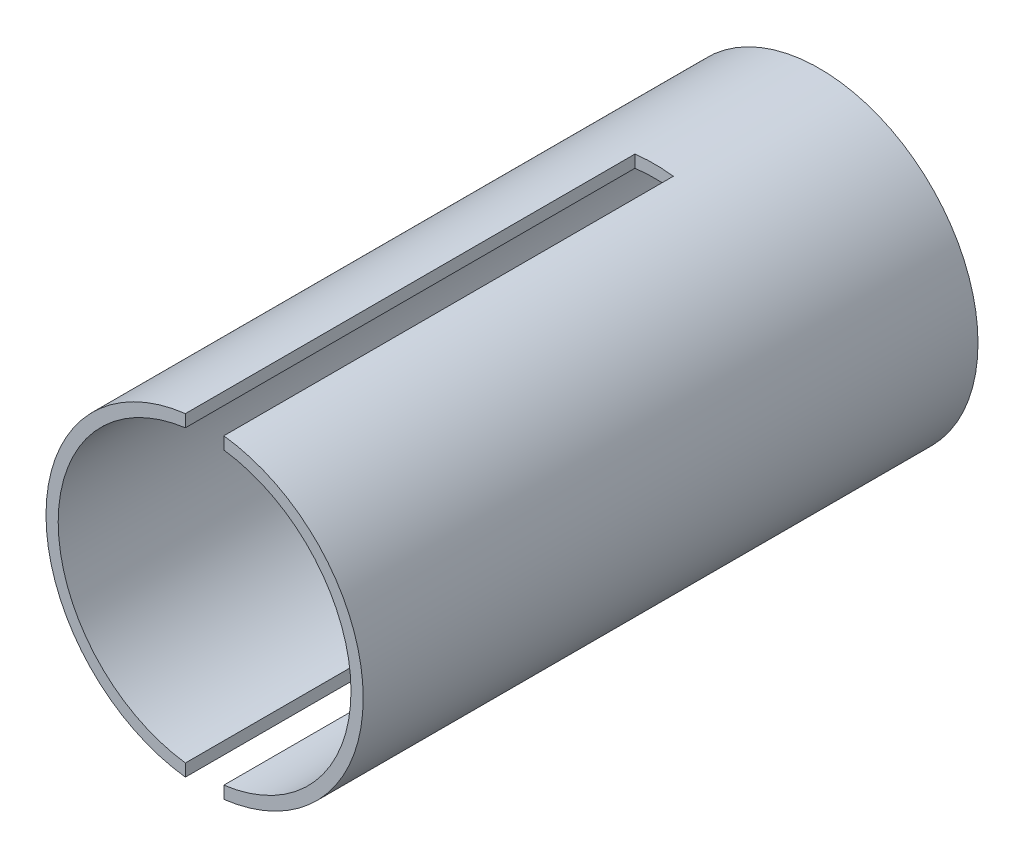
ISO-10303-21;
HEADER;
FILE_DESCRIPTION(('STEP AP214'),'2;1');
FILE_NAME('part.step','',(''),(''),'','','');
FILE_SCHEMA(('AUTOMOTIVE_DESIGN { 1 0 10303 214 1 1 1 1 }'));
ENDSEC;
DATA;
#1=APPLICATION_CONTEXT('core data for automotive mechanical design processes');
#2=APPLICATION_PROTOCOL_DEFINITION('international standard','automotive_design',2000,#1);
#3=PRODUCT_CONTEXT('',#1,'mechanical');
#4=PRODUCT('Part','Part','',(#3));
#5=PRODUCT_RELATED_PRODUCT_CATEGORY('part','',(#4));
#6=PRODUCT_DEFINITION_FORMATION('','',#4);
#7=PRODUCT_DEFINITION_CONTEXT('part definition',#1,'design');
#8=PRODUCT_DEFINITION('design','',#6,#7);
#9=PRODUCT_DEFINITION_SHAPE('','',#8);
#10=(LENGTH_UNIT() NAMED_UNIT(*) SI_UNIT(.MILLI.,.METRE.));
#11=(NAMED_UNIT(*) PLANE_ANGLE_UNIT() SI_UNIT($,.RADIAN.));
#12=(NAMED_UNIT(*) SI_UNIT($,.STERADIAN.) SOLID_ANGLE_UNIT());
#13=UNCERTAINTY_MEASURE_WITH_UNIT(LENGTH_MEASURE(1.E-05),#10,'distance_accuracy_value','');
#14=(GEOMETRIC_REPRESENTATION_CONTEXT(3) GLOBAL_UNCERTAINTY_ASSIGNED_CONTEXT((#13)) GLOBAL_UNIT_ASSIGNED_CONTEXT((#10,
#11,#12)) REPRESENTATION_CONTEXT('',''));
#15=CARTESIAN_POINT('',(0.,0.,0.));
#16=DIRECTION('',(0.,0.,1.));
#17=DIRECTION('',(1.,0.,0.));
#18=AXIS2_PLACEMENT_3D('',#15,#16,#17);
#19=CARTESIAN_POINT('',(0.,0.,160.));
#20=DIRECTION('',(0.,0.,1.));
#21=DIRECTION('',(1.,0.,0.));
#22=AXIS2_PLACEMENT_3D('',#19,#20,#21);
#23=PLANE('',#22);
#24=CARTESIAN_POINT('',(0.,0.,160.));
#25=DIRECTION('',(0.,0.,1.));
#26=DIRECTION('',(1.,0.,0.));
#27=AXIS2_PLACEMENT_3D('',#24,#25,#26);
#28=CIRCLE('',#27,38.1);
#29=CARTESIAN_POINT('',(-5.,37.7704911273338,160.));
#30=VERTEX_POINT('',#29);
#31=CARTESIAN_POINT('',(-5.,-37.7704911273338,160.));
#32=VERTEX_POINT('',#31);
#33=EDGE_CURVE('E169',#30,#32,#28,.T.);
#34=ORIENTED_EDGE('',*,*,#33,.F.);
#35=DIRECTION('',(0.,-1.,0.));
#36=VECTOR('',#35,1.);
#37=CARTESIAN_POINT('',(-5.,50.,160.));
#38=LINE('',#37,#36);
#39=CARTESIAN_POINT('',(-5.,40.9710339752367,160.));
#40=VERTEX_POINT('',#39);
#41=EDGE_CURVE('E203',#40,#30,#38,.T.);
#42=ORIENTED_EDGE('',*,*,#41,.F.);
#43=CARTESIAN_POINT('',(0.,0.,160.));
#44=DIRECTION('',(0.,0.,1.));
#45=DIRECTION('',(1.,0.,0.));
#46=AXIS2_PLACEMENT_3D('',#43,#44,#45);
#47=CIRCLE('',#46,41.275);
#48=CARTESIAN_POINT('',(-5.,-40.9710339752367,160.));
#49=VERTEX_POINT('',#48);
#50=EDGE_CURVE('E177',#40,#49,#47,.T.);
#51=ORIENTED_EDGE('',*,*,#50,.T.);
#52=DIRECTION('',(0.,1.,0.));
#53=VECTOR('',#52,1.);
#54=CARTESIAN_POINT('',(-5.,-50.,160.));
#55=LINE('',#54,#53);
#56=EDGE_CURVE('E137',#49,#32,#55,.T.);
#57=ORIENTED_EDGE('',*,*,#56,.T.);
#58=EDGE_LOOP('',(#34,#42,#51,#57));
#59=FACE_BOUND('',#58,.T.);
#60=ADVANCED_FACE('F45',(#59),#23,.T.);
#61=CARTESIAN_POINT('',(5.,-40.9710339752367,160.));
#62=VERTEX_POINT('',#61);
#63=CARTESIAN_POINT('',(5.,40.9710339752367,160.));
#64=VERTEX_POINT('',#63);
#65=EDGE_CURVE('E173',#62,#64,#47,.T.);
#66=ORIENTED_EDGE('',*,*,#65,.T.);
#67=DIRECTION('',(0.,-1.,0.));
#68=VECTOR('',#67,1.);
#69=CARTESIAN_POINT('',(5.,50.,160.));
#70=LINE('',#69,#68);
#71=CARTESIAN_POINT('',(5.,37.7704911273338,160.));
#72=VERTEX_POINT('',#71);
#73=EDGE_CURVE('E113',#64,#72,#70,.T.);
#74=ORIENTED_EDGE('',*,*,#73,.T.);
#75=CARTESIAN_POINT('',(5.,-37.7704911273338,160.));
#76=VERTEX_POINT('',#75);
#77=EDGE_CURVE('E164',#76,#72,#28,.T.);
#78=ORIENTED_EDGE('',*,*,#77,.F.);
#79=DIRECTION('',(0.,1.,0.));
#80=VECTOR('',#79,1.);
#81=CARTESIAN_POINT('',(5.,-50.,160.));
#82=LINE('',#81,#80);
#83=EDGE_CURVE('E146',#62,#76,#82,.T.);
#84=ORIENTED_EDGE('',*,*,#83,.F.);
#85=EDGE_LOOP('',(#66,#74,#78,#84));
#86=FACE_BOUND('',#85,.T.);
#87=ADVANCED_FACE('F212',(#86),#23,.T.);
#88=CARTESIAN_POINT('',(0.,0.,160.));
#89=DIRECTION('',(0.,0.,-1.));
#90=DIRECTION('',(-1.,0.,0.));
#91=AXIS2_PLACEMENT_3D('',#88,#89,#90);
#92=CYLINDRICAL_SURFACE('',#91,41.275);
#93=CARTESIAN_POINT('',(0.,0.,0.));
#94=DIRECTION('',(0.,0.,1.));
#95=DIRECTION('',(1.,0.,0.));
#96=AXIS2_PLACEMENT_3D('',#93,#94,#95);
#97=CIRCLE('',#96,41.275);
#98=CARTESIAN_POINT('',(41.275,0.,0.));
#99=VERTEX_POINT('',#98);
#100=EDGE_CURVE('E168',#99,#99,#97,.T.);
#101=ORIENTED_EDGE('',*,*,#100,.T.);
#102=EDGE_LOOP('',(#101));
#103=FACE_BOUND('',#102,.T.);
#104=DIRECTION('',(0.,0.,-1.));
#105=VECTOR('',#104,1.);
#106=CARTESIAN_POINT('',(-5.,40.9710339752367,160.));
#107=LINE('',#106,#105);
#108=CARTESIAN_POINT('',(-5.,40.9710339752367,43.));
#109=VERTEX_POINT('',#108);
#110=EDGE_CURVE('E119',#109,#40,#107,.F.);
#111=ORIENTED_EDGE('',*,*,#110,.F.);
#112=CARTESIAN_POINT('',(0.,0.,43.));
#113=DIRECTION('',(0.,0.,-1.));
#114=DIRECTION('',(-1.,0.,0.));
#115=AXIS2_PLACEMENT_3D('',#112,#113,#114);
#116=CIRCLE('',#115,41.275);
#117=CARTESIAN_POINT('',(5.,40.9710339752367,43.));
#118=VERTEX_POINT('',#117);
#119=EDGE_CURVE('E125',#109,#118,#116,.T.);
#120=ORIENTED_EDGE('',*,*,#119,.T.);
#121=DIRECTION('',(0.,0.,-1.));
#122=VECTOR('',#121,1.);
#123=CARTESIAN_POINT('',(5.,40.9710339752367,160.));
#124=LINE('',#123,#122);
#125=EDGE_CURVE('E110',#64,#118,#124,.T.);
#126=ORIENTED_EDGE('',*,*,#125,.F.);
#127=ORIENTED_EDGE('',*,*,#65,.F.);
#128=DIRECTION('',(0.,0.,-1.));
#129=VECTOR('',#128,1.);
#130=CARTESIAN_POINT('',(5.,-40.9710339752367,160.));
#131=LINE('',#130,#129);
#132=CARTESIAN_POINT('',(5.,-40.9710339752367,100.));
#133=VERTEX_POINT('',#132);
#134=EDGE_CURVE('E155',#62,#133,#131,.T.);
#135=ORIENTED_EDGE('',*,*,#134,.T.);
#136=CARTESIAN_POINT('',(0.,0.,100.));
#137=DIRECTION('',(0.,0.,-1.));
#138=DIRECTION('',(-1.,0.,0.));
#139=AXIS2_PLACEMENT_3D('',#136,#137,#138);
#140=CIRCLE('',#139,41.275);
#141=CARTESIAN_POINT('',(-5.,-40.9710339752367,100.));
#142=VERTEX_POINT('',#141);
#143=EDGE_CURVE('E159',#133,#142,#140,.T.);
#144=ORIENTED_EDGE('',*,*,#143,.T.);
#145=DIRECTION('',(0.,0.,-1.));
#146=VECTOR('',#145,1.);
#147=CARTESIAN_POINT('',(-5.,-40.9710339752367,160.));
#148=LINE('',#147,#146);
#149=EDGE_CURVE('E145',#142,#49,#148,.F.);
#150=ORIENTED_EDGE('',*,*,#149,.T.);
#151=ORIENTED_EDGE('',*,*,#50,.F.);
#152=EDGE_LOOP('',(#111,#120,#126,#127,#135,#144,#150,#151));
#153=FACE_BOUND('',#152,.T.);
#154=ADVANCED_FACE('F47',(#103,#153),#92,.T.);
#155=CARTESIAN_POINT('',(0.,0.,160.));
#156=DIRECTION('',(0.,0.,-1.));
#157=DIRECTION('',(-1.,0.,0.));
#158=AXIS2_PLACEMENT_3D('',#155,#156,#157);
#159=CYLINDRICAL_SURFACE('',#158,38.1);
#160=CARTESIAN_POINT('',(0.,0.,0.));
#161=DIRECTION('',(0.,0.,1.));
#162=DIRECTION('',(1.,0.,0.));
#163=AXIS2_PLACEMENT_3D('',#160,#161,#162);
#164=CIRCLE('',#163,38.1);
#165=CARTESIAN_POINT('',(38.1,0.,0.));
#166=VERTEX_POINT('',#165);
#167=EDGE_CURVE('E163',#166,#166,#164,.T.);
#168=ORIENTED_EDGE('',*,*,#167,.F.);
#169=EDGE_LOOP('',(#168));
#170=FACE_BOUND('',#169,.T.);
#171=CARTESIAN_POINT('',(0.,0.,43.));
#172=DIRECTION('',(0.,0.,-1.));
#173=DIRECTION('',(-1.,0.,0.));
#174=AXIS2_PLACEMENT_3D('',#171,#172,#173);
#175=CIRCLE('',#174,38.1);
#176=CARTESIAN_POINT('',(-5.,37.7704911273338,43.));
#177=VERTEX_POINT('',#176);
#178=CARTESIAN_POINT('',(5.,37.7704911273338,43.));
#179=VERTEX_POINT('',#178);
#180=EDGE_CURVE('E54',#177,#179,#175,.T.);
#181=ORIENTED_EDGE('',*,*,#180,.F.);
#182=DIRECTION('',(0.,0.,-1.));
#183=VECTOR('',#182,1.);
#184=CARTESIAN_POINT('',(-5.,37.7704911273338,160.));
#185=LINE('',#184,#183);
#186=EDGE_CURVE('E11',#177,#30,#185,.F.);
#187=ORIENTED_EDGE('',*,*,#186,.T.);
#188=ORIENTED_EDGE('',*,*,#33,.T.);
#189=DIRECTION('',(0.,0.,-1.));
#190=VECTOR('',#189,1.);
#191=CARTESIAN_POINT('',(-5.,-37.7704911273338,160.));
#192=LINE('',#191,#190);
#193=CARTESIAN_POINT('',(-5.,-37.7704911273338,100.));
#194=VERTEX_POINT('',#193);
#195=EDGE_CURVE('E176',#194,#32,#192,.F.);
#196=ORIENTED_EDGE('',*,*,#195,.F.);
#197=CARTESIAN_POINT('',(0.,0.,100.));
#198=DIRECTION('',(0.,0.,-1.));
#199=DIRECTION('',(-1.,0.,0.));
#200=AXIS2_PLACEMENT_3D('',#197,#198,#199);
#201=CIRCLE('',#200,38.1);
#202=CARTESIAN_POINT('',(5.,-37.7704911273338,100.));
#203=VERTEX_POINT('',#202);
#204=EDGE_CURVE('E183',#203,#194,#201,.T.);
#205=ORIENTED_EDGE('',*,*,#204,.F.);
#206=DIRECTION('',(0.,0.,-1.));
#207=VECTOR('',#206,1.);
#208=CARTESIAN_POINT('',(5.,-37.7704911273338,160.));
#209=LINE('',#208,#207);
#210=EDGE_CURVE('E186',#76,#203,#209,.T.);
#211=ORIENTED_EDGE('',*,*,#210,.F.);
#212=ORIENTED_EDGE('',*,*,#77,.T.);
#213=DIRECTION('',(0.,0.,-1.));
#214=VECTOR('',#213,1.);
#215=CARTESIAN_POINT('',(5.,37.7704911273338,160.));
#216=LINE('',#215,#214);
#217=EDGE_CURVE('E189',#72,#179,#216,.T.);
#218=ORIENTED_EDGE('',*,*,#217,.T.);
#219=EDGE_LOOP('',(#181,#187,#188,#196,#205,#211,#212,#218));
#220=FACE_BOUND('',#219,.T.);
#221=ADVANCED_FACE('F197',(#170,#220),#159,.F.);
#222=CARTESIAN_POINT('',(0.,0.,0.));
#223=DIRECTION('',(0.,0.,1.));
#224=DIRECTION('',(1.,0.,0.));
#225=AXIS2_PLACEMENT_3D('',#222,#223,#224);
#226=PLANE('',#225);
#227=ORIENTED_EDGE('',*,*,#100,.F.);
#228=EDGE_LOOP('',(#227));
#229=FACE_BOUND('',#228,.T.);
#230=ORIENTED_EDGE('',*,*,#167,.T.);
#231=EDGE_LOOP('',(#230));
#232=FACE_BOUND('',#231,.T.);
#233=ADVANCED_FACE('F237',(#229,#232),#226,.F.);
#234=CARTESIAN_POINT('',(-5.,-50.,100.));
#235=DIRECTION('',(0.,0.,-1.));
#236=DIRECTION('',(-1.,0.,0.));
#237=AXIS2_PLACEMENT_3D('',#234,#235,#236);
#238=PLANE('',#237);
#239=DIRECTION('',(0.,1.,0.));
#240=VECTOR('',#239,1.);
#241=CARTESIAN_POINT('',(5.,-50.,100.));
#242=LINE('',#241,#240);
#243=EDGE_CURVE('E141',#133,#203,#242,.T.);
#244=ORIENTED_EDGE('',*,*,#243,.T.);
#245=ORIENTED_EDGE('',*,*,#204,.T.);
#246=DIRECTION('',(0.,1.,0.));
#247=VECTOR('',#246,1.);
#248=CARTESIAN_POINT('',(-5.,-50.,100.));
#249=LINE('',#248,#247);
#250=EDGE_CURVE('E69',#142,#194,#249,.T.);
#251=ORIENTED_EDGE('',*,*,#250,.F.);
#252=ORIENTED_EDGE('',*,*,#143,.F.);
#253=EDGE_LOOP('',(#244,#245,#251,#252));
#254=FACE_BOUND('',#253,.T.);
#255=ADVANCED_FACE('F205',(#254),#238,.F.);
#256=CARTESIAN_POINT('',(5.,-50.,160.));
#257=DIRECTION('',(1.,0.,0.));
#258=DIRECTION('',(0.,0.,-1.));
#259=AXIS2_PLACEMENT_3D('',#256,#257,#258);
#260=PLANE('',#259);
#261=ORIENTED_EDGE('',*,*,#83,.T.);
#262=ORIENTED_EDGE('',*,*,#210,.T.);
#263=ORIENTED_EDGE('',*,*,#243,.F.);
#264=ORIENTED_EDGE('',*,*,#134,.F.);
#265=EDGE_LOOP('',(#261,#262,#263,#264));
#266=FACE_BOUND('',#265,.T.);
#267=ADVANCED_FACE('F243',(#266),#260,.F.);
#268=CARTESIAN_POINT('',(-5.,-50.,100.));
#269=DIRECTION('',(-1.,0.,0.));
#270=DIRECTION('',(0.,0.,1.));
#271=AXIS2_PLACEMENT_3D('',#268,#269,#270);
#272=PLANE('',#271);
#273=ORIENTED_EDGE('',*,*,#250,.T.);
#274=ORIENTED_EDGE('',*,*,#195,.T.);
#275=ORIENTED_EDGE('',*,*,#56,.F.);
#276=ORIENTED_EDGE('',*,*,#149,.F.);
#277=EDGE_LOOP('',(#273,#274,#275,#276));
#278=FACE_BOUND('',#277,.T.);
#279=ADVANCED_FACE('F202',(#278),#272,.F.);
#280=CARTESIAN_POINT('',(0.,50.,43.));
#281=DIRECTION('',(0.,0.,-1.));
#282=DIRECTION('',(-1.,0.,0.));
#283=AXIS2_PLACEMENT_3D('',#280,#281,#282);
#284=PLANE('',#283);
#285=DIRECTION('',(0.,-1.,0.));
#286=VECTOR('',#285,1.);
#287=CARTESIAN_POINT('',(-5.,50.,43.));
#288=LINE('',#287,#286);
#289=EDGE_CURVE('E120',#109,#177,#288,.T.);
#290=ORIENTED_EDGE('',*,*,#289,.T.);
#291=ORIENTED_EDGE('',*,*,#180,.T.);
#292=DIRECTION('',(0.,-1.,0.));
#293=VECTOR('',#292,1.);
#294=CARTESIAN_POINT('',(5.,50.,43.));
#295=LINE('',#294,#293);
#296=EDGE_CURVE('E61',#118,#179,#295,.T.);
#297=ORIENTED_EDGE('',*,*,#296,.F.);
#298=ORIENTED_EDGE('',*,*,#119,.F.);
#299=EDGE_LOOP('',(#290,#291,#297,#298));
#300=FACE_BOUND('',#299,.T.);
#301=ADVANCED_FACE('F124',(#300),#284,.F.);
#302=CARTESIAN_POINT('',(-5.,50.,0.));
#303=DIRECTION('',(1.,0.,0.));
#304=DIRECTION('',(0.,0.,-1.));
#305=AXIS2_PLACEMENT_3D('',#302,#303,#304);
#306=PLANE('',#305);
#307=ORIENTED_EDGE('',*,*,#110,.T.);
#308=ORIENTED_EDGE('',*,*,#41,.T.);
#309=ORIENTED_EDGE('',*,*,#186,.F.);
#310=ORIENTED_EDGE('',*,*,#289,.F.);
#311=EDGE_LOOP('',(#307,#308,#309,#310));
#312=FACE_BOUND('',#311,.T.);
#313=ADVANCED_FACE('F220',(#312),#306,.T.);
#314=CARTESIAN_POINT('',(5.,50.,0.));
#315=DIRECTION('',(-1.,0.,0.));
#316=DIRECTION('',(0.,0.,1.));
#317=AXIS2_PLACEMENT_3D('',#314,#315,#316);
#318=PLANE('',#317);
#319=ORIENTED_EDGE('',*,*,#125,.T.);
#320=ORIENTED_EDGE('',*,*,#296,.T.);
#321=ORIENTED_EDGE('',*,*,#217,.F.);
#322=ORIENTED_EDGE('',*,*,#73,.F.);
#323=EDGE_LOOP('',(#319,#320,#321,#322));
#324=FACE_BOUND('',#323,.T.);
#325=ADVANCED_FACE('F111',(#324),#318,.T.);
#326=CLOSED_SHELL('',(#60,#87,#154,#221,#233,#255,#267,#279,#301,#313,#325));
#327=MANIFOLD_SOLID_BREP('B2',#326);
#328=ADVANCED_BREP_SHAPE_REPRESENTATION('',(#18,#327),#14);
#329=SHAPE_DEFINITION_REPRESENTATION(#9,#328);
ENDSEC;
END-ISO-10303-21;
